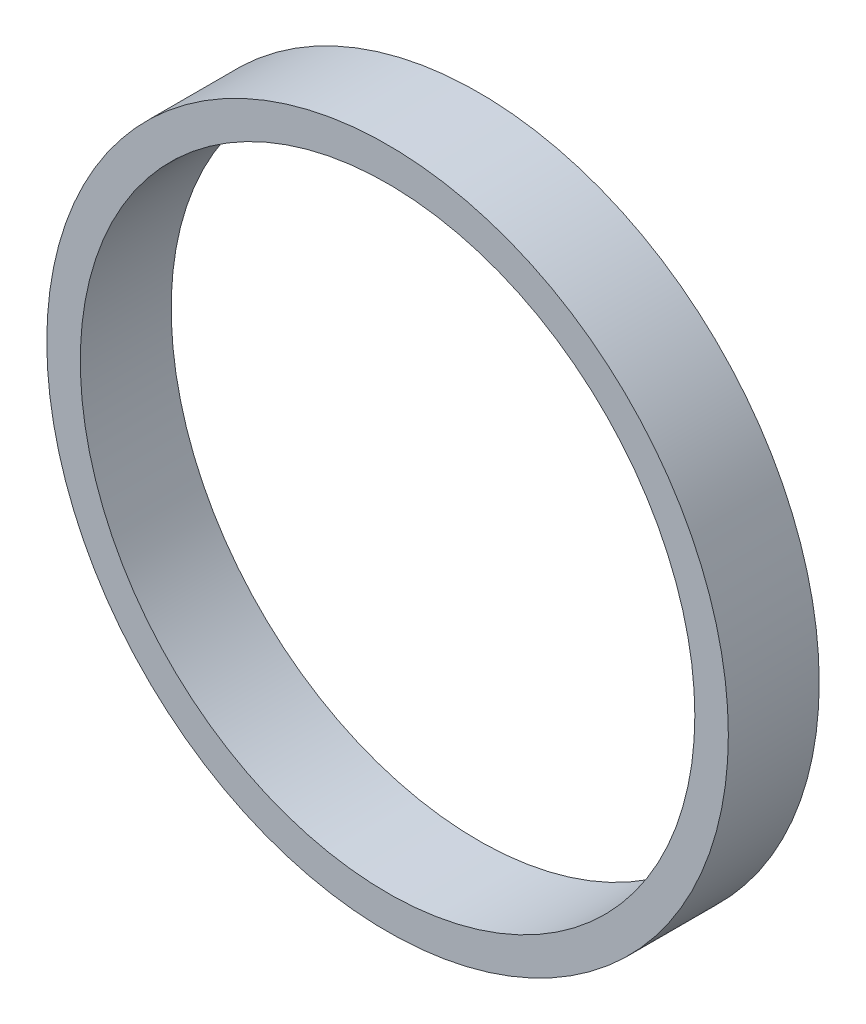
ISO-10303-21;
HEADER;
FILE_DESCRIPTION(('STEP AP214'),'2;1');
FILE_NAME('part.step','',(''),(''),'','','');
FILE_SCHEMA(('AUTOMOTIVE_DESIGN { 1 0 10303 214 1 1 1 1 }'));
ENDSEC;
DATA;
#1=APPLICATION_CONTEXT('core data for automotive mechanical design processes');
#2=APPLICATION_PROTOCOL_DEFINITION('international standard','automotive_design',2000,#1);
#3=PRODUCT_CONTEXT('',#1,'mechanical');
#4=PRODUCT('Part','Part','',(#3));
#5=PRODUCT_RELATED_PRODUCT_CATEGORY('part','',(#4));
#6=PRODUCT_DEFINITION_FORMATION('','',#4);
#7=PRODUCT_DEFINITION_CONTEXT('part definition',#1,'design');
#8=PRODUCT_DEFINITION('design','',#6,#7);
#9=PRODUCT_DEFINITION_SHAPE('','',#8);
#10=(LENGTH_UNIT() NAMED_UNIT(*) SI_UNIT(.MILLI.,.METRE.));
#11=(NAMED_UNIT(*) PLANE_ANGLE_UNIT() SI_UNIT($,.RADIAN.));
#12=(NAMED_UNIT(*) SI_UNIT($,.STERADIAN.) SOLID_ANGLE_UNIT());
#13=UNCERTAINTY_MEASURE_WITH_UNIT(LENGTH_MEASURE(1.E-05),#10,'distance_accuracy_value','');
#14=(GEOMETRIC_REPRESENTATION_CONTEXT(3) GLOBAL_UNCERTAINTY_ASSIGNED_CONTEXT((#13)) GLOBAL_UNIT_ASSIGNED_CONTEXT((#10,
#11,#12)) REPRESENTATION_CONTEXT('',''));
#15=CARTESIAN_POINT('',(0.,0.,0.));
#16=DIRECTION('',(0.,0.,1.));
#17=DIRECTION('',(1.,0.,0.));
#18=AXIS2_PLACEMENT_3D('',#15,#16,#17);
#19=CARTESIAN_POINT('',(0.,0.,4.));
#20=DIRECTION('',(0.,0.,-1.));
#21=DIRECTION('',(-1.,0.,0.));
#22=AXIS2_PLACEMENT_3D('',#19,#20,#21);
#23=CYLINDRICAL_SURFACE('',#22,15.);
#24=CARTESIAN_POINT('',(0.,0.,4.));
#25=DIRECTION('',(0.,0.,1.));
#26=DIRECTION('',(1.,0.,0.));
#27=AXIS2_PLACEMENT_3D('',#24,#25,#26);
#28=CIRCLE('',#27,15.);
#29=CARTESIAN_POINT('',(15.,0.,4.));
#30=VERTEX_POINT('',#29);
#31=EDGE_CURVE('E10',#30,#30,#28,.T.);
#32=ORIENTED_EDGE('',*,*,#31,.F.);
#33=EDGE_LOOP('',(#32));
#34=FACE_BOUND('',#33,.T.);
#35=CARTESIAN_POINT('',(0.,0.,0.));
#36=DIRECTION('',(0.,0.,1.));
#37=DIRECTION('',(1.,0.,0.));
#38=AXIS2_PLACEMENT_3D('',#35,#36,#37);
#39=CIRCLE('',#38,15.);
#40=CARTESIAN_POINT('',(15.,0.,0.));
#41=VERTEX_POINT('',#40);
#42=EDGE_CURVE('E46',#41,#41,#39,.T.);
#43=ORIENTED_EDGE('',*,*,#42,.T.);
#44=EDGE_LOOP('',(#43));
#45=FACE_BOUND('',#44,.T.);
#46=ADVANCED_FACE('F43',(#34,#45),#23,.T.);
#47=CARTESIAN_POINT('',(0.,0.,4.));
#48=DIRECTION('',(0.,0.,1.));
#49=DIRECTION('',(1.,0.,0.));
#50=AXIS2_PLACEMENT_3D('',#47,#48,#49);
#51=PLANE('',#50);
#52=CARTESIAN_POINT('',(0.,0.,4.));
#53=DIRECTION('',(0.,0.,1.));
#54=DIRECTION('',(1.,0.,0.));
#55=AXIS2_PLACEMENT_3D('',#52,#53,#54);
#56=CIRCLE('',#55,13.525);
#57=CARTESIAN_POINT('',(13.525,0.,4.));
#58=VERTEX_POINT('',#57);
#59=EDGE_CURVE('E57',#58,#58,#56,.T.);
#60=ORIENTED_EDGE('',*,*,#59,.F.);
#61=EDGE_LOOP('',(#60));
#62=FACE_BOUND('',#61,.T.);
#63=ORIENTED_EDGE('',*,*,#31,.T.);
#64=EDGE_LOOP('',(#63));
#65=FACE_BOUND('',#64,.T.);
#66=ADVANCED_FACE('F74',(#62,#65),#51,.T.);
#67=CARTESIAN_POINT('',(0.,0.,0.));
#68=DIRECTION('',(0.,0.,1.));
#69=DIRECTION('',(1.,0.,0.));
#70=AXIS2_PLACEMENT_3D('',#67,#68,#69);
#71=PLANE('',#70);
#72=CARTESIAN_POINT('',(0.,0.,0.));
#73=DIRECTION('',(0.,0.,1.));
#74=DIRECTION('',(1.,0.,0.));
#75=AXIS2_PLACEMENT_3D('',#72,#73,#74);
#76=CIRCLE('',#75,13.525);
#77=CARTESIAN_POINT('',(13.525,0.,0.));
#78=VERTEX_POINT('',#77);
#79=EDGE_CURVE('E55',#78,#78,#76,.T.);
#80=ORIENTED_EDGE('',*,*,#79,.T.);
#81=EDGE_LOOP('',(#80));
#82=FACE_BOUND('',#81,.T.);
#83=ORIENTED_EDGE('',*,*,#42,.F.);
#84=EDGE_LOOP('',(#83));
#85=FACE_BOUND('',#84,.T.);
#86=ADVANCED_FACE('F65',(#82,#85),#71,.F.);
#87=CARTESIAN_POINT('',(0.,0.,0.));
#88=DIRECTION('',(0.,0.,1.));
#89=DIRECTION('',(1.,0.,0.));
#90=AXIS2_PLACEMENT_3D('',#87,#88,#89);
#91=CYLINDRICAL_SURFACE('',#90,13.525);
#92=ORIENTED_EDGE('',*,*,#79,.F.);
#93=EDGE_LOOP('',(#92));
#94=FACE_BOUND('',#93,.T.);
#95=ORIENTED_EDGE('',*,*,#59,.T.);
#96=EDGE_LOOP('',(#95));
#97=FACE_BOUND('',#96,.T.);
#98=ADVANCED_FACE('F68',(#94,#97),#91,.F.);
#99=CLOSED_SHELL('',(#46,#66,#86,#98));
#100=MANIFOLD_SOLID_BREP('B2',#99);
#101=ADVANCED_BREP_SHAPE_REPRESENTATION('',(#18,#100),#14);
#102=SHAPE_DEFINITION_REPRESENTATION(#9,#101);
ENDSEC;
END-ISO-10303-21;
